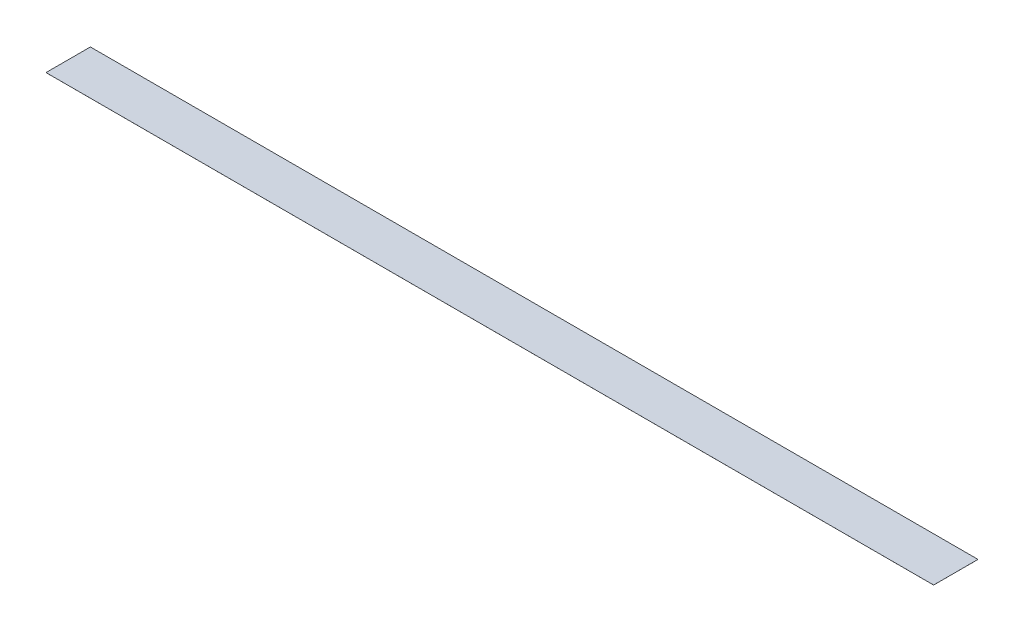
ISO-10303-21;
HEADER;
FILE_DESCRIPTION(('STEP AP214'),'2;1');
FILE_NAME('part.step','',(''),(''),'','','');
FILE_SCHEMA(('AUTOMOTIVE_DESIGN { 1 0 10303 214 1 1 1 1 }'));
ENDSEC;
DATA;
#1=APPLICATION_CONTEXT('core data for automotive mechanical design processes');
#2=APPLICATION_PROTOCOL_DEFINITION('international standard','automotive_design',2000,#1);
#3=PRODUCT_CONTEXT('',#1,'mechanical');
#4=PRODUCT('Part','Part','',(#3));
#5=PRODUCT_RELATED_PRODUCT_CATEGORY('part','',(#4));
#6=PRODUCT_DEFINITION_FORMATION('','',#4);
#7=PRODUCT_DEFINITION_CONTEXT('part definition',#1,'design');
#8=PRODUCT_DEFINITION('design','',#6,#7);
#9=PRODUCT_DEFINITION_SHAPE('','',#8);
#10=(LENGTH_UNIT() NAMED_UNIT(*) SI_UNIT(.MILLI.,.METRE.));
#11=(NAMED_UNIT(*) PLANE_ANGLE_UNIT() SI_UNIT($,.RADIAN.));
#12=(NAMED_UNIT(*) SI_UNIT($,.STERADIAN.) SOLID_ANGLE_UNIT());
#13=UNCERTAINTY_MEASURE_WITH_UNIT(LENGTH_MEASURE(1.E-05),#10,'distance_accuracy_value','');
#14=(GEOMETRIC_REPRESENTATION_CONTEXT(3) GLOBAL_UNCERTAINTY_ASSIGNED_CONTEXT((#13)) GLOBAL_UNIT_ASSIGNED_CONTEXT((#10,
#11,#12)) REPRESENTATION_CONTEXT('',''));
#15=CARTESIAN_POINT('',(0.,0.,0.));
#16=DIRECTION('',(0.,0.,1.));
#17=DIRECTION('',(1.,0.,0.));
#18=AXIS2_PLACEMENT_3D('',#15,#16,#17);
#19=CARTESIAN_POINT('',(694.276767168742,0.01,-1067.5028404586));
#20=DIRECTION('',(-1.,0.,0.));
#21=DIRECTION('',(0.,0.,1.));
#22=AXIS2_PLACEMENT_3D('',#19,#20,#21);
#23=PLANE('',#22);
#24=DIRECTION('',(0.,0.,-1.));
#25=VECTOR('',#24,1.);
#26=CARTESIAN_POINT('',(694.276767168742,0.,-1067.5028404586));
#27=LINE('',#26,#25);
#28=CARTESIAN_POINT('',(694.276767168742,0.,-1067.5028404586));
#29=VERTEX_POINT('',#28);
#30=CARTESIAN_POINT('',(694.276767168743,0.,-1087.5028404586));
#31=VERTEX_POINT('',#30);
#32=EDGE_CURVE('E107',#29,#31,#27,.T.);
#33=ORIENTED_EDGE('',*,*,#32,.T.);
#34=DIRECTION('',(0.,-1.,0.));
#35=VECTOR('',#34,1.);
#36=CARTESIAN_POINT('',(694.276767168743,0.01,-1087.5028404586));
#37=LINE('',#36,#35);
#38=CARTESIAN_POINT('',(694.276767168743,0.01,-1087.5028404586));
#39=VERTEX_POINT('',#38);
#40=EDGE_CURVE('E11',#39,#31,#37,.T.);
#41=ORIENTED_EDGE('',*,*,#40,.F.);
#42=DIRECTION('',(0.,0.,-1.));
#43=VECTOR('',#42,1.);
#44=CARTESIAN_POINT('',(694.276767168742,0.01,-1067.5028404586));
#45=LINE('',#44,#43);
#46=CARTESIAN_POINT('',(694.276767168742,0.01,-1067.5028404586));
#47=VERTEX_POINT('',#46);
#48=EDGE_CURVE('E89',#47,#39,#45,.T.);
#49=ORIENTED_EDGE('',*,*,#48,.F.);
#50=DIRECTION('',(0.,-1.,0.));
#51=VECTOR('',#50,1.);
#52=CARTESIAN_POINT('',(694.276767168742,0.01,-1067.5028404586));
#53=LINE('',#52,#51);
#54=EDGE_CURVE('E56',#47,#29,#53,.T.);
#55=ORIENTED_EDGE('',*,*,#54,.T.);
#56=EDGE_LOOP('',(#33,#41,#49,#55));
#57=FACE_BOUND('',#56,.T.);
#58=ADVANCED_FACE('F39',(#57),#23,.F.);
#59=CARTESIAN_POINT('',(694.276767168743,0.01,-1087.5028404586));
#60=DIRECTION('',(0.,0.,1.));
#61=DIRECTION('',(1.,0.,0.));
#62=AXIS2_PLACEMENT_3D('',#59,#60,#61);
#63=PLANE('',#62);
#64=DIRECTION('',(-1.,0.,0.));
#65=VECTOR('',#64,1.);
#66=CARTESIAN_POINT('',(694.276767168743,0.,-1087.5028404586));
#67=LINE('',#66,#65);
#68=CARTESIAN_POINT('',(294.276767168743,0.,-1087.5028404586));
#69=VERTEX_POINT('',#68);
#70=EDGE_CURVE('E95',#31,#69,#67,.T.);
#71=ORIENTED_EDGE('',*,*,#70,.T.);
#72=DIRECTION('',(0.,-1.,0.));
#73=VECTOR('',#72,1.);
#74=CARTESIAN_POINT('',(294.276767168743,0.01,-1087.5028404586));
#75=LINE('',#74,#73);
#76=CARTESIAN_POINT('',(294.276767168743,0.01,-1087.5028404586));
#77=VERTEX_POINT('',#76);
#78=EDGE_CURVE('E48',#77,#69,#75,.T.);
#79=ORIENTED_EDGE('',*,*,#78,.F.);
#80=DIRECTION('',(-1.,0.,0.));
#81=VECTOR('',#80,1.);
#82=CARTESIAN_POINT('',(694.276767168743,0.01,-1087.5028404586));
#83=LINE('',#82,#81);
#84=EDGE_CURVE('E81',#39,#77,#83,.T.);
#85=ORIENTED_EDGE('',*,*,#84,.F.);
#86=ORIENTED_EDGE('',*,*,#40,.T.);
#87=EDGE_LOOP('',(#71,#79,#85,#86));
#88=FACE_BOUND('',#87,.T.);
#89=ADVANCED_FACE('F94',(#88),#63,.F.);
#90=CARTESIAN_POINT('',(294.276767168743,0.01,-1067.5028404586));
#91=DIRECTION('',(-1.,0.,0.));
#92=DIRECTION('',(0.,0.,1.));
#93=AXIS2_PLACEMENT_3D('',#90,#91,#92);
#94=PLANE('',#93);
#95=DIRECTION('',(0.,0.,-1.));
#96=VECTOR('',#95,1.);
#97=CARTESIAN_POINT('',(294.276767168743,0.,-1067.5028404586));
#98=LINE('',#97,#96);
#99=CARTESIAN_POINT('',(294.276767168743,0.,-1067.5028404586));
#100=VERTEX_POINT('',#99);
#101=EDGE_CURVE('E112',#100,#69,#98,.T.);
#102=ORIENTED_EDGE('',*,*,#101,.F.);
#103=DIRECTION('',(0.,-1.,0.));
#104=VECTOR('',#103,1.);
#105=CARTESIAN_POINT('',(294.276767168743,0.01,-1067.5028404586));
#106=LINE('',#105,#104);
#107=CARTESIAN_POINT('',(294.276767168743,0.01,-1067.5028404586));
#108=VERTEX_POINT('',#107);
#109=EDGE_CURVE('E70',#108,#100,#106,.T.);
#110=ORIENTED_EDGE('',*,*,#109,.F.);
#111=DIRECTION('',(0.,0.,-1.));
#112=VECTOR('',#111,1.);
#113=CARTESIAN_POINT('',(294.276767168743,0.01,-1067.5028404586));
#114=LINE('',#113,#112);
#115=EDGE_CURVE('E88',#108,#77,#114,.T.);
#116=ORIENTED_EDGE('',*,*,#115,.T.);
#117=ORIENTED_EDGE('',*,*,#78,.T.);
#118=EDGE_LOOP('',(#102,#110,#116,#117));
#119=FACE_BOUND('',#118,.T.);
#120=ADVANCED_FACE('F99',(#119),#94,.T.);
#121=CARTESIAN_POINT('',(694.276767168742,0.01,-1067.5028404586));
#122=DIRECTION('',(0.,0.,1.));
#123=DIRECTION('',(1.,0.,0.));
#124=AXIS2_PLACEMENT_3D('',#121,#122,#123);
#125=PLANE('',#124);
#126=DIRECTION('',(-1.,0.,0.));
#127=VECTOR('',#126,1.);
#128=CARTESIAN_POINT('',(694.276767168742,0.,-1067.5028404586));
#129=LINE('',#128,#127);
#130=EDGE_CURVE('E115',#29,#100,#129,.T.);
#131=ORIENTED_EDGE('',*,*,#130,.F.);
#132=ORIENTED_EDGE('',*,*,#54,.F.);
#133=DIRECTION('',(-1.,0.,0.));
#134=VECTOR('',#133,1.);
#135=CARTESIAN_POINT('',(694.276767168742,0.01,-1067.5028404586));
#136=LINE('',#135,#134);
#137=EDGE_CURVE('E101',#47,#108,#136,.T.);
#138=ORIENTED_EDGE('',*,*,#137,.T.);
#139=ORIENTED_EDGE('',*,*,#109,.T.);
#140=EDGE_LOOP('',(#131,#132,#138,#139));
#141=FACE_BOUND('',#140,.T.);
#142=ADVANCED_FACE('F125',(#141),#125,.T.);
#143=CARTESIAN_POINT('',(0.,0.01,0.));
#144=DIRECTION('',(0.,1.,0.));
#145=DIRECTION('',(0.,0.,1.));
#146=AXIS2_PLACEMENT_3D('',#143,#144,#145);
#147=PLANE('',#146);
#148=ORIENTED_EDGE('',*,*,#48,.T.);
#149=ORIENTED_EDGE('',*,*,#84,.T.);
#150=ORIENTED_EDGE('',*,*,#115,.F.);
#151=ORIENTED_EDGE('',*,*,#137,.F.);
#152=EDGE_LOOP('',(#148,#149,#150,#151));
#153=FACE_BOUND('',#152,.T.);
#154=ADVANCED_FACE('F85',(#153),#147,.T.);
#155=CARTESIAN_POINT('',(0.,0.,0.));
#156=DIRECTION('',(0.,1.,0.));
#157=DIRECTION('',(0.,0.,1.));
#158=AXIS2_PLACEMENT_3D('',#155,#156,#157);
#159=PLANE('',#158);
#160=ORIENTED_EDGE('',*,*,#32,.F.);
#161=ORIENTED_EDGE('',*,*,#130,.T.);
#162=ORIENTED_EDGE('',*,*,#101,.T.);
#163=ORIENTED_EDGE('',*,*,#70,.F.);
#164=EDGE_LOOP('',(#160,#161,#162,#163));
#165=FACE_BOUND('',#164,.T.);
#166=ADVANCED_FACE('F124',(#165),#159,.F.);
#167=CLOSED_SHELL('',(#58,#89,#120,#142,#154,#166));
#168=MANIFOLD_SOLID_BREP('B2',#167);
#169=ADVANCED_BREP_SHAPE_REPRESENTATION('',(#18,#168),#14);
#170=SHAPE_DEFINITION_REPRESENTATION(#9,#169);
ENDSEC;
END-ISO-10303-21;
